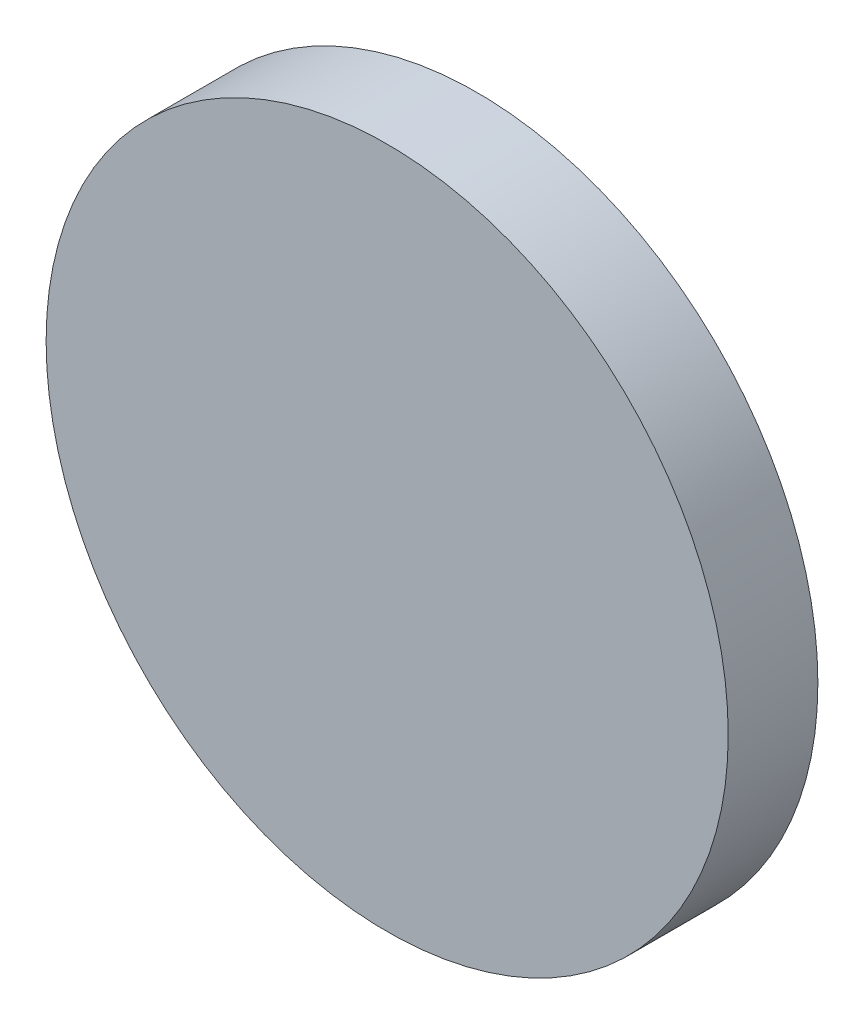
ISO-10303-21;
HEADER;
FILE_DESCRIPTION(('STEP AP214'),'2;1');
FILE_NAME('part.step','',(''),(''),'','','');
FILE_SCHEMA(('AUTOMOTIVE_DESIGN { 1 0 10303 214 1 1 1 1 }'));
ENDSEC;
DATA;
#1=APPLICATION_CONTEXT('core data for automotive mechanical design processes');
#2=APPLICATION_PROTOCOL_DEFINITION('international standard','automotive_design',2000,#1);
#3=PRODUCT_CONTEXT('',#1,'mechanical');
#4=PRODUCT('Part','Part','',(#3));
#5=PRODUCT_RELATED_PRODUCT_CATEGORY('part','',(#4));
#6=PRODUCT_DEFINITION_FORMATION('','',#4);
#7=PRODUCT_DEFINITION_CONTEXT('part definition',#1,'design');
#8=PRODUCT_DEFINITION('design','',#6,#7);
#9=PRODUCT_DEFINITION_SHAPE('','',#8);
#10=(LENGTH_UNIT() NAMED_UNIT(*) SI_UNIT(.MILLI.,.METRE.));
#11=(NAMED_UNIT(*) PLANE_ANGLE_UNIT() SI_UNIT($,.RADIAN.));
#12=(NAMED_UNIT(*) SI_UNIT($,.STERADIAN.) SOLID_ANGLE_UNIT());
#13=UNCERTAINTY_MEASURE_WITH_UNIT(LENGTH_MEASURE(1.E-05),#10,'distance_accuracy_value','');
#14=(GEOMETRIC_REPRESENTATION_CONTEXT(3) GLOBAL_UNCERTAINTY_ASSIGNED_CONTEXT((#13)) GLOBAL_UNIT_ASSIGNED_CONTEXT((#10,
#11,#12)) REPRESENTATION_CONTEXT('',''));
#15=CARTESIAN_POINT('',(0.,0.,0.));
#16=DIRECTION('',(0.,0.,1.));
#17=DIRECTION('',(1.,0.,0.));
#18=AXIS2_PLACEMENT_3D('',#15,#16,#17);
#19=CARTESIAN_POINT('',(0.,0.,3.175));
#20=DIRECTION('',(0.,0.,-1.));
#21=DIRECTION('',(-1.,0.,0.));
#22=AXIS2_PLACEMENT_3D('',#19,#20,#21);
#23=CYLINDRICAL_SURFACE('',#22,12.0777);
#24=CARTESIAN_POINT('',(0.,0.,3.175));
#25=DIRECTION('',(0.,0.,1.));
#26=DIRECTION('',(1.,0.,0.));
#27=AXIS2_PLACEMENT_3D('',#24,#25,#26);
#28=CIRCLE('',#27,12.0777);
#29=CARTESIAN_POINT('',(12.0777,0.,3.175));
#30=VERTEX_POINT('',#29);
#31=EDGE_CURVE('E11',#30,#30,#28,.T.);
#32=ORIENTED_EDGE('',*,*,#31,.F.);
#33=EDGE_LOOP('',(#32));
#34=FACE_BOUND('',#33,.T.);
#35=CARTESIAN_POINT('',(0.,0.,0.));
#36=DIRECTION('',(0.,0.,1.));
#37=DIRECTION('',(1.,0.,0.));
#38=AXIS2_PLACEMENT_3D('',#35,#36,#37);
#39=CIRCLE('',#38,12.0777);
#40=CARTESIAN_POINT('',(12.0777,0.,0.));
#41=VERTEX_POINT('',#40);
#42=EDGE_CURVE('E40',#41,#41,#39,.T.);
#43=ORIENTED_EDGE('',*,*,#42,.T.);
#44=EDGE_LOOP('',(#43));
#45=FACE_BOUND('',#44,.T.);
#46=ADVANCED_FACE('F37',(#34,#45),#23,.T.);
#47=CARTESIAN_POINT('',(0.,0.,3.175));
#48=DIRECTION('',(0.,0.,1.));
#49=DIRECTION('',(1.,0.,0.));
#50=AXIS2_PLACEMENT_3D('',#47,#48,#49);
#51=PLANE('',#50);
#52=ORIENTED_EDGE('',*,*,#31,.T.);
#53=EDGE_LOOP('',(#52));
#54=FACE_BOUND('',#53,.T.);
#55=ADVANCED_FACE('F54',(#54),#51,.T.);
#56=CARTESIAN_POINT('',(0.,0.,0.));
#57=DIRECTION('',(0.,0.,1.));
#58=DIRECTION('',(1.,0.,0.));
#59=AXIS2_PLACEMENT_3D('',#56,#57,#58);
#60=PLANE('',#59);
#61=ORIENTED_EDGE('',*,*,#42,.F.);
#62=EDGE_LOOP('',(#61));
#63=FACE_BOUND('',#62,.T.);
#64=ADVANCED_FACE('F52',(#63),#60,.F.);
#65=CLOSED_SHELL('',(#46,#55,#64));
#66=MANIFOLD_SOLID_BREP('B2',#65);
#67=ADVANCED_BREP_SHAPE_REPRESENTATION('',(#18,#66),#14);
#68=SHAPE_DEFINITION_REPRESENTATION(#9,#67);
ENDSEC;
END-ISO-10303-21;
